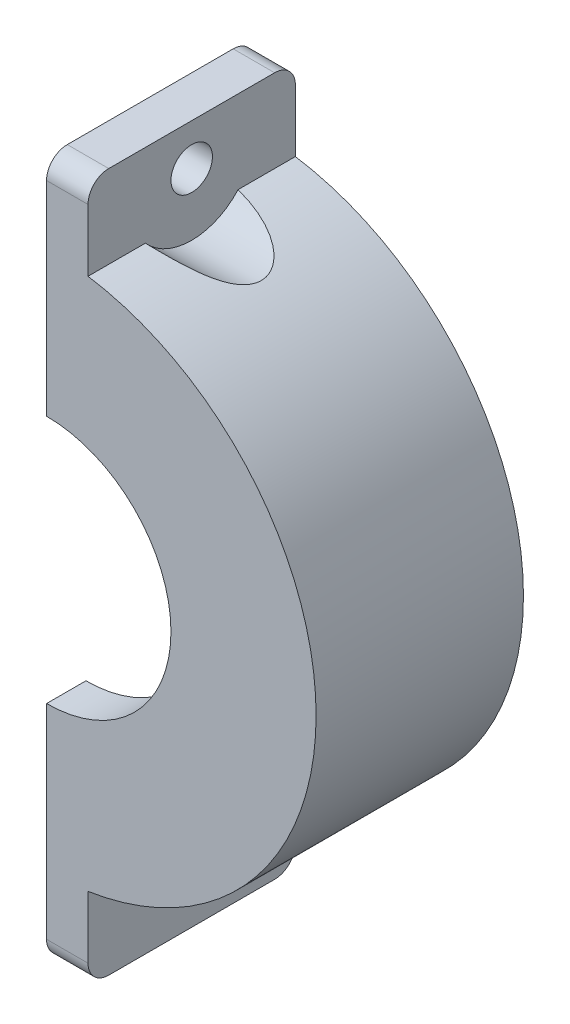
ISO-10303-21;
HEADER;
FILE_DESCRIPTION(('STEP AP214'),'2;1');
FILE_NAME('part.step','',(''),(''),'','','');
FILE_SCHEMA(('AUTOMOTIVE_DESIGN { 1 0 10303 214 1 1 1 1 }'));
ENDSEC;
DATA;
#1=APPLICATION_CONTEXT('core data for automotive mechanical design processes');
#2=APPLICATION_PROTOCOL_DEFINITION('international standard','automotive_design',2000,#1);
#3=PRODUCT_CONTEXT('',#1,'mechanical');
#4=PRODUCT('Part','Part','',(#3));
#5=PRODUCT_RELATED_PRODUCT_CATEGORY('part','',(#4));
#6=PRODUCT_DEFINITION_FORMATION('','',#4);
#7=PRODUCT_DEFINITION_CONTEXT('part definition',#1,'design');
#8=PRODUCT_DEFINITION('design','',#6,#7);
#9=PRODUCT_DEFINITION_SHAPE('','',#8);
#10=(LENGTH_UNIT() NAMED_UNIT(*) SI_UNIT(.MILLI.,.METRE.));
#11=(NAMED_UNIT(*) PLANE_ANGLE_UNIT() SI_UNIT($,.RADIAN.));
#12=(NAMED_UNIT(*) SI_UNIT($,.STERADIAN.) SOLID_ANGLE_UNIT());
#13=UNCERTAINTY_MEASURE_WITH_UNIT(LENGTH_MEASURE(1.E-05),#10,'distance_accuracy_value','');
#14=(GEOMETRIC_REPRESENTATION_CONTEXT(3) GLOBAL_UNCERTAINTY_ASSIGNED_CONTEXT((#13)) GLOBAL_UNIT_ASSIGNED_CONTEXT((#10,
#11,#12)) REPRESENTATION_CONTEXT('',''));
#15=CARTESIAN_POINT('',(0.,0.,0.));
#16=DIRECTION('',(0.,0.,1.));
#17=DIRECTION('',(1.,0.,0.));
#18=AXIS2_PLACEMENT_3D('',#15,#16,#17);
#19=CARTESIAN_POINT('',(0.,0.,0.));
#20=DIRECTION('',(1.,0.,0.));
#21=DIRECTION('',(0.,0.,-1.));
#22=AXIS2_PLACEMENT_3D('',#19,#20,#21);
#23=PLANE('',#22);
#24=CARTESIAN_POINT('',(0.,-14.845233,5.));
#25=DIRECTION('',(1.,0.,0.));
#26=DIRECTION('',(0.,0.,-1.));
#27=AXIS2_PLACEMENT_3D('',#24,#25,#26);
#28=CIRCLE('',#27,1.);
#29=CARTESIAN_POINT('',(0.,-14.845233,4.));
#30=VERTEX_POINT('',#29);
#31=EDGE_CURVE('E270',#30,#30,#28,.T.);
#32=ORIENTED_EDGE('',*,*,#31,.T.);
#33=EDGE_LOOP('',(#32));
#34=FACE_BOUND('',#33,.T.);
#35=DIRECTION('',(0.,0.,1.));
#36=VECTOR('',#35,1.);
#37=CARTESIAN_POINT('',(0.,-16.845233,0.));
#38=LINE('',#37,#36);
#39=CARTESIAN_POINT('',(0.,-16.845233,1.));
#40=VERTEX_POINT('',#39);
#41=CARTESIAN_POINT('',(0.,-16.845233,9.));
#42=VERTEX_POINT('',#41);
#43=EDGE_CURVE('E260',#40,#42,#38,.T.);
#44=ORIENTED_EDGE('',*,*,#43,.T.);
#45=CARTESIAN_POINT('',(0.,-15.845233,9.));
#46=DIRECTION('',(1.,0.,0.));
#47=DIRECTION('',(0.,0.,-1.));
#48=AXIS2_PLACEMENT_3D('',#45,#46,#47);
#49=CIRCLE('',#48,1.);
#50=CARTESIAN_POINT('',(0.,-15.845233,10.));
#51=VERTEX_POINT('',#50);
#52=EDGE_CURVE('E11',#42,#51,#49,.F.);
#53=ORIENTED_EDGE('',*,*,#52,.T.);
#54=DIRECTION('',(0.,1.,0.));
#55=VECTOR('',#54,1.);
#56=CARTESIAN_POINT('',(0.,0.,10.));
#57=LINE('',#56,#55);
#58=CARTESIAN_POINT('',(0.,-6.,10.));
#59=VERTEX_POINT('',#58);
#60=EDGE_CURVE('E197',#51,#59,#57,.T.);
#61=ORIENTED_EDGE('',*,*,#60,.T.);
#62=DIRECTION('',(0.,0.,-1.));
#63=VECTOR('',#62,1.);
#64=CARTESIAN_POINT('',(0.,-6.,18.1));
#65=LINE('',#64,#63);
#66=CARTESIAN_POINT('',(0.,-6.,8.1));
#67=VERTEX_POINT('',#66);
#68=EDGE_CURVE('E276',#59,#67,#65,.T.);
#69=ORIENTED_EDGE('',*,*,#68,.T.);
#70=DIRECTION('',(0.,1.,0.));
#71=VECTOR('',#70,1.);
#72=CARTESIAN_POINT('',(0.,0.,8.1));
#73=LINE('',#72,#71);
#74=CARTESIAN_POINT('',(0.,-11.,8.1));
#75=VERTEX_POINT('',#74);
#76=EDGE_CURVE('E208',#75,#67,#73,.T.);
#77=ORIENTED_EDGE('',*,*,#76,.F.);
#78=DIRECTION('',(0.,0.,-1.));
#79=VECTOR('',#78,1.);
#80=CARTESIAN_POINT('',(0.,-11.,8.1));
#81=LINE('',#80,#79);
#82=CARTESIAN_POINT('',(0.,-11.,0.));
#83=VERTEX_POINT('',#82);
#84=EDGE_CURVE('E214',#75,#83,#81,.T.);
#85=ORIENTED_EDGE('',*,*,#84,.T.);
#86=DIRECTION('',(0.,1.,0.));
#87=VECTOR('',#86,1.);
#88=CARTESIAN_POINT('',(0.,0.,0.));
#89=LINE('',#88,#87);
#90=CARTESIAN_POINT('',(0.,-15.845233,0.));
#91=VERTEX_POINT('',#90);
#92=EDGE_CURVE('E205',#91,#83,#89,.T.);
#93=ORIENTED_EDGE('',*,*,#92,.F.);
#94=CARTESIAN_POINT('',(0.,-15.845233,1.));
#95=DIRECTION('',(1.,0.,0.));
#96=DIRECTION('',(0.,0.,-1.));
#97=AXIS2_PLACEMENT_3D('',#94,#95,#96);
#98=CIRCLE('',#97,1.);
#99=EDGE_CURVE('E220',#91,#40,#98,.F.);
#100=ORIENTED_EDGE('',*,*,#99,.T.);
#101=EDGE_LOOP('',(#44,#53,#61,#69,#77,#85,#93,#100));
#102=FACE_BOUND('',#101,.T.);
#103=ADVANCED_FACE('F41',(#34,#102),#23,.F.);
#104=CARTESIAN_POINT('',(0.,0.,10.));
#105=DIRECTION('',(0.,0.,-1.));
#106=DIRECTION('',(-1.,0.,0.));
#107=AXIS2_PLACEMENT_3D('',#104,#105,#106);
#108=CYLINDRICAL_SURFACE('',#107,13.);
#109=DIRECTION('',(0.,0.,-1.));
#110=VECTOR('',#109,1.);
#111=CARTESIAN_POINT('',(2.,-12.8452325786651,10.));
#112=LINE('',#111,#110);
#113=CARTESIAN_POINT('',(2.,-12.8452325786651,7.23606760064635));
#114=VERTEX_POINT('',#113);
#115=CARTESIAN_POINT('',(2.,-12.8452325786651,10.));
#116=VERTEX_POINT('',#115);
#117=EDGE_CURVE('E166',#114,#116,#112,.F.);
#118=ORIENTED_EDGE('',*,*,#117,.F.);
#119=CARTESIAN_POINT('',(2.,-12.8452325786651,7.23606760064635));
#120=CARTESIAN_POINT('',(2.08276539776827,-12.832346383096,7.22453780908436));
#121=CARTESIAN_POINT('',(2.16528098528265,-12.8186787917862,7.21211732607741));
#122=CARTESIAN_POINT('',(2.32974059715563,-12.7898116161668,7.18532230038956));
#123=CARTESIAN_POINT('',(2.41168451084763,-12.7746117435749,7.17094738982602));
#124=CARTESIAN_POINT('',(2.65711028370859,-12.7266491932216,7.12452421743763));
#125=CARTESIAN_POINT('',(2.8195699401386,-12.6916197771942,7.08926058654797));
#126=CARTESIAN_POINT('',(3.14215760745936,-12.6156480987045,7.00800369253263));
#127=CARTESIAN_POINT('',(3.30224769106317,-12.5746517541744,6.96190962505904));
#128=CARTESIAN_POINT('',(3.61658186305981,-12.4878660355328,6.85674135085243));
#129=CARTESIAN_POINT('',(3.77083613340113,-12.4420855886643,6.79769110189736));
#130=CARTESIAN_POINT('',(3.97780972230637,-12.3766158727657,6.70496027102279));
#131=CARTESIAN_POINT('',(4.03414540459908,-12.3583617373446,6.67827071728123));
#132=CARTESIAN_POINT('',(4.14539272047412,-12.3214915049511,6.62229889927634));
#133=CARTESIAN_POINT('',(4.20030430207607,-12.3028753948097,6.59301654054607));
#134=CARTESIAN_POINT('',(4.3625132342028,-12.2466944619012,6.5009288139637));
#135=CARTESIAN_POINT('',(4.4673466430409,-12.208777343158,6.43385582725093));
#136=CARTESIAN_POINT('',(4.6686308718264,-12.1332422156882,6.28535766469762));
#137=CARTESIAN_POINT('',(4.764971682875,-12.0956326336012,6.20377661192219));
#138=CARTESIAN_POINT('',(4.94300569032877,-12.0239688496214,6.02455659258834));
#139=CARTESIAN_POINT('',(5.02474358317832,-11.9899039367217,5.92696844267873));
#140=CARTESIAN_POINT('',(5.13892380583905,-11.9412617927331,5.75597563300521));
#141=CARTESIAN_POINT('',(5.17819705472851,-11.9242469912654,5.68784475398095));
#142=CARTESIAN_POINT('',(5.24641863713935,-11.8943883114915,5.54568849700293));
#143=CARTESIAN_POINT('',(5.27537408037415,-11.8815415616452,5.47166722115098));
#144=CARTESIAN_POINT('',(5.32102514929996,-11.8611693984822,5.31840252847306));
#145=CARTESIAN_POINT('',(5.3376067430378,-11.8536935034973,5.23911769871211));
#146=CARTESIAN_POINT('',(5.35646045740204,-11.8451867800537,5.07853089842933));
#147=CARTESIAN_POINT('',(5.35874393372024,-11.8441508369327,4.99723058016503));
#148=CARTESIAN_POINT('',(5.34939656220391,-11.8483739608607,4.84532774436822));
#149=CARTESIAN_POINT('',(5.33938023482922,-11.8529026393309,4.77459772969805));
#150=CARTESIAN_POINT('',(5.30888625918949,-11.8665918891346,4.63591122426401));
#151=CARTESIAN_POINT('',(5.288403644229,-11.8757546595193,4.56795606683569));
#152=CARTESIAN_POINT('',(5.23136426522048,-11.9010099321451,4.41790416213146));
#153=CARTESIAN_POINT('',(5.19192450300897,-11.9183197311891,4.337114649377));
#154=CARTESIAN_POINT('',(5.10136001388693,-11.9573644241691,4.18359085337653));
#155=CARTESIAN_POINT('',(5.05021471874528,-11.9791070998478,4.11087108778678));
#156=CARTESIAN_POINT('',(4.91167957000135,-12.0367520441712,3.93973642309407));
#157=CARTESIAN_POINT('',(4.81885308344476,-12.0743498810984,3.84633192644882));
#158=CARTESIAN_POINT('',(4.62027394399353,-12.1517286562157,3.67567094434097));
#159=CARTESIAN_POINT('',(4.51449183887476,-12.1915144509099,3.59845237610348));
#160=CARTESIAN_POINT('',(4.30689725962327,-12.2662709427615,3.46570941127435));
#161=CARTESIAN_POINT('',(4.20601760849179,-12.3012712574403,3.40871328465918));
#162=CARTESIAN_POINT('',(3.99922788188801,-12.3700470385925,3.30371065734754));
#163=CARTESIAN_POINT('',(3.89331371615758,-12.4038214684184,3.25571162835656));
#164=CARTESIAN_POINT('',(3.67745382580164,-12.4695273011324,3.16722510875975));
#165=CARTESIAN_POINT('',(3.56749636174045,-12.5014525077052,3.12676196724583));
#166=CARTESIAN_POINT('',(3.34478467306144,-12.562872156966,3.05239828887136));
#167=CARTESIAN_POINT('',(3.23203139038285,-12.5923674042359,3.01849557473736));
#168=CARTESIAN_POINT('',(3.02675195791729,-12.6430870336786,2.96243212255445));
#169=CARTESIAN_POINT('',(2.93461383158742,-12.6647965205399,2.93927374085533));
#170=CARTESIAN_POINT('',(2.749166290102,-12.7063414816939,2.89618478999816));
#171=CARTESIAN_POINT('',(2.65585683789329,-12.726176896533,2.87625432322912));
#172=CARTESIAN_POINT('',(2.46921353075594,-12.7636966745003,2.83946939464871));
#173=CARTESIAN_POINT('',(2.37588919666887,-12.7814005142867,2.82258624261788));
#174=CARTESIAN_POINT('',(2.18848061890501,-12.8148204603245,2.79139532580996));
#175=CARTESIAN_POINT('',(2.09439656754685,-12.8305370538318,2.77708692935912));
#176=CARTESIAN_POINT('',(2.,-12.8452325786651,2.76393239935364));
#177=B_SPLINE_CURVE_WITH_KNOTS('',3,(#119,#120,#121,#122,#123,#124,#125,#126,#127,#128,#129,
#130,#131,#132,#133,#134,#135,#136,#137,#138,#139,#140,#141,#142,#143,#144,#145,#146,#147,#148,
#149,#150,#151,#152,#153,#154,#155,#156,#157,#158,#159,#160,#161,#162,#163,#164,#165,#166,#167,
#168,#169,#170,#171,#172,#173,#174,#175,#176),.UNSPECIFIED.,.F.,.F.,(4,2,2,2,2,2,2,2,2,2,2,2,2,
2,2,2,2,2,2,2,2,2,2,2,2,2,2,2,4),(0.,0.253638270320282,0.507324349334978,1.01658094320564,
1.53077960076528,2.04403532894383,2.23884410768089,2.43365998705591,2.82308167551149,
3.21697250796355,3.60963625995656,3.85020837130518,4.09061438905581,4.33320941411776,
4.57561174359325,4.78933039348787,5.00315055622355,5.27629269482021,5.54991851749505,
5.95846349908766,6.36795510015366,6.73054948404562,7.09344366577697,7.4574907838873,
7.82141687410746,8.11369577669264,8.40598394850822,8.69535761917483,8.98466019971424),.UNSPECIFIED.);
#178=CARTESIAN_POINT('',(2.,-12.8452325786651,2.76393239935365));
#179=VERTEX_POINT('',#178);
#180=EDGE_CURVE('E155',#114,#179,#177,.T.);
#181=ORIENTED_EDGE('',*,*,#180,.T.);
#182=CARTESIAN_POINT('',(2.,-12.8452325786651,0.));
#183=VERTEX_POINT('',#182);
#184=EDGE_CURVE('E163',#183,#179,#112,.F.);
#185=ORIENTED_EDGE('',*,*,#184,.F.);
#186=CARTESIAN_POINT('',(0.,0.,0.));
#187=DIRECTION('',(0.,0.,1.));
#188=DIRECTION('',(1.,0.,0.));
#189=AXIS2_PLACEMENT_3D('',#186,#187,#188);
#190=CIRCLE('',#189,13.);
#191=CARTESIAN_POINT('',(2.,12.8452325786651,0.));
#192=VERTEX_POINT('',#191);
#193=EDGE_CURVE('E199',#183,#192,#190,.T.);
#194=ORIENTED_EDGE('',*,*,#193,.T.);
#195=DIRECTION('',(0.,0.,-1.));
#196=VECTOR('',#195,1.);
#197=CARTESIAN_POINT('',(2.,12.8452325786651,10.));
#198=LINE('',#197,#196);
#199=CARTESIAN_POINT('',(2.,12.8452325786651,2.76393239935365));
#200=VERTEX_POINT('',#199);
#201=EDGE_CURVE('E187',#200,#192,#198,.T.);
#202=ORIENTED_EDGE('',*,*,#201,.F.);
#203=CARTESIAN_POINT('',(2.,12.8452325786651,2.76393239935365));
#204=CARTESIAN_POINT('',(2.08276539776826,12.832346383096,2.77546219091565));
#205=CARTESIAN_POINT('',(2.16528098528265,12.8186787917862,2.78788267392259));
#206=CARTESIAN_POINT('',(2.32974059715562,12.7898116161668,2.81467769961044));
#207=CARTESIAN_POINT('',(2.41168451084762,12.7746117435749,2.82905261017398));
#208=CARTESIAN_POINT('',(2.65711028370858,12.7266491932216,2.87547578256238));
#209=CARTESIAN_POINT('',(2.8195699401386,12.6916197771942,2.91073941345203));
#210=CARTESIAN_POINT('',(3.14215760745935,12.6156480987045,2.99199630746737));
#211=CARTESIAN_POINT('',(3.30224769106316,12.5746517541744,3.03809037494096));
#212=CARTESIAN_POINT('',(3.61658186305981,12.4878660355328,3.14325864914758));
#213=CARTESIAN_POINT('',(3.77083613340113,12.4420855886643,3.20230889810264));
#214=CARTESIAN_POINT('',(3.97780972230637,12.3766158727657,3.29503972897721));
#215=CARTESIAN_POINT('',(4.03414540459908,12.3583617373446,3.32172928271878));
#216=CARTESIAN_POINT('',(4.14539272047412,12.3214915049511,3.37770110072366));
#217=CARTESIAN_POINT('',(4.20030430207607,12.3028753948097,3.40698345945394));
#218=CARTESIAN_POINT('',(4.3625132342028,12.2466944619012,3.4990711860363));
#219=CARTESIAN_POINT('',(4.4673466430409,12.208777343158,3.56614417274907));
#220=CARTESIAN_POINT('',(4.6686308718264,12.1332422156882,3.71464233530238));
#221=CARTESIAN_POINT('',(4.764971682875,12.0956326336012,3.79622338807781));
#222=CARTESIAN_POINT('',(4.94300569032877,12.0239688496214,3.97544340741166));
#223=CARTESIAN_POINT('',(5.02474358317832,11.9899039367217,4.07303155732127));
#224=CARTESIAN_POINT('',(5.13892380583905,11.9412617927331,4.24402436699479));
#225=CARTESIAN_POINT('',(5.17819705472851,11.9242469912654,4.31215524601905));
#226=CARTESIAN_POINT('',(5.24641863713935,11.8943883114915,4.45431150299707));
#227=CARTESIAN_POINT('',(5.27537408037415,11.8815415616452,4.52833277884902));
#228=CARTESIAN_POINT('',(5.32102514929996,11.8611693984822,4.68159747152695));
#229=CARTESIAN_POINT('',(5.3376067430378,11.8536935034973,4.76088230128789));
#230=CARTESIAN_POINT('',(5.35646045740204,11.8451867800537,4.92146910157067));
#231=CARTESIAN_POINT('',(5.35874393372023,11.8441508369327,5.00276941983497));
#232=CARTESIAN_POINT('',(5.3493965622039,11.8483739608607,5.15467225563178));
#233=CARTESIAN_POINT('',(5.33938023482922,11.8529026393309,5.22540227030195));
#234=CARTESIAN_POINT('',(5.30888625918949,11.8665918891346,5.36408877573599));
#235=CARTESIAN_POINT('',(5.28840364422899,11.8757546595193,5.43204393316431));
#236=CARTESIAN_POINT('',(5.23136426522048,11.9010099321451,5.58209583786854));
#237=CARTESIAN_POINT('',(5.19192450300896,11.9183197311891,5.66288535062301));
#238=CARTESIAN_POINT('',(5.10136001388693,11.9573644241691,5.81640914662347));
#239=CARTESIAN_POINT('',(5.05021471874528,11.9791070998478,5.88912891221322));
#240=CARTESIAN_POINT('',(4.91167957000135,12.0367520441712,6.06026357690593));
#241=CARTESIAN_POINT('',(4.81885308344476,12.0743498810984,6.15366807355119));
#242=CARTESIAN_POINT('',(4.62027394399354,12.1517286562157,6.32432905565904));
#243=CARTESIAN_POINT('',(4.51449183887476,12.1915144509099,6.40154762389653));
#244=CARTESIAN_POINT('',(4.30689725962327,12.2662709427615,6.53429058872565));
#245=CARTESIAN_POINT('',(4.20601760849179,12.3012712574403,6.59128671534082));
#246=CARTESIAN_POINT('',(3.99922788188801,12.3700470385925,6.69628934265246));
#247=CARTESIAN_POINT('',(3.89331371615759,12.4038214684184,6.74428837164344));
#248=CARTESIAN_POINT('',(3.67745382580164,12.4695273011324,6.83277489124025));
#249=CARTESIAN_POINT('',(3.56749636174046,12.5014525077052,6.87323803275417));
#250=CARTESIAN_POINT('',(3.34478467306145,12.562872156966,6.94760171112864));
#251=CARTESIAN_POINT('',(3.23203139038285,12.5923674042359,6.98150442526265));
#252=CARTESIAN_POINT('',(3.0267519579173,12.6430870336786,7.03756787744555));
#253=CARTESIAN_POINT('',(2.93461383158742,12.6647965205399,7.06072625914467));
#254=CARTESIAN_POINT('',(2.749166290102,12.7063414816939,7.10381521000184));
#255=CARTESIAN_POINT('',(2.65585683789329,12.726176896533,7.12374567677088));
#256=CARTESIAN_POINT('',(2.46921353075594,12.7636966745003,7.16053060535129));
#257=CARTESIAN_POINT('',(2.37588919666887,12.7814005142867,7.17741375738212));
#258=CARTESIAN_POINT('',(2.18848061890501,12.8148204603245,7.20860467419005));
#259=CARTESIAN_POINT('',(2.09439656754685,12.8305370538318,7.22291307064089));
#260=CARTESIAN_POINT('',(2.,12.8452325786651,7.23606760064636));
#261=B_SPLINE_CURVE_WITH_KNOTS('',3,(#203,#204,#205,#206,#207,#208,#209,#210,#211,#212,#213,
#214,#215,#216,#217,#218,#219,#220,#221,#222,#223,#224,#225,#226,#227,#228,#229,#230,#231,#232,
#233,#234,#235,#236,#237,#238,#239,#240,#241,#242,#243,#244,#245,#246,#247,#248,#249,#250,#251,
#252,#253,#254,#255,#256,#257,#258,#259,#260),.UNSPECIFIED.,.F.,.F.,(4,2,2,2,2,2,2,2,2,2,2,2,2,
2,2,2,2,2,2,2,2,2,2,2,2,2,2,2,4),(0.,0.253638270320283,0.507324349334978,1.01658094320564,
1.53077960076528,2.04403532894383,2.23884410768089,2.43365998705591,2.82308167551149,
3.21697250796356,3.60963625995656,3.85020837130519,4.09061438905581,4.33320941411776,
4.57561174359326,4.78933039348788,5.00315055622356,5.27629269482022,5.54991851749506,
5.95846349908767,6.36795510015366,6.73054948404563,7.09344366577697,7.4574907838873,
7.82141687410746,8.11369577669264,8.40598394850822,8.69535761917484,8.98466019971425),.UNSPECIFIED.);
#262=CARTESIAN_POINT('',(2.,12.8452325786651,7.23606760064635));
#263=VERTEX_POINT('',#262);
#264=EDGE_CURVE('E286',#200,#263,#261,.T.);
#265=ORIENTED_EDGE('',*,*,#264,.T.);
#266=CARTESIAN_POINT('',(2.,12.8452325786651,10.));
#267=VERTEX_POINT('',#266);
#268=EDGE_CURVE('E188',#267,#263,#198,.T.);
#269=ORIENTED_EDGE('',*,*,#268,.F.);
#270=CARTESIAN_POINT('',(0.,0.,10.));
#271=DIRECTION('',(0.,0.,1.));
#272=DIRECTION('',(1.,0.,0.));
#273=AXIS2_PLACEMENT_3D('',#270,#271,#272);
#274=CIRCLE('',#273,13.);
#275=EDGE_CURVE('E200',#116,#267,#274,.T.);
#276=ORIENTED_EDGE('',*,*,#275,.F.);
#277=EDGE_LOOP('',(#118,#181,#185,#194,#202,#265,#269,#276));
#278=FACE_BOUND('',#277,.T.);
#279=ADVANCED_FACE('F161',(#278),#108,.T.);
#280=CARTESIAN_POINT('',(0.,0.,10.));
#281=DIRECTION('',(0.,0.,1.));
#282=DIRECTION('',(1.,0.,0.));
#283=AXIS2_PLACEMENT_3D('',#280,#281,#282);
#284=PLANE('',#283);
#285=ORIENTED_EDGE('',*,*,#60,.F.);
#286=DIRECTION('',(1.,0.,0.));
#287=VECTOR('',#286,1.);
#288=CARTESIAN_POINT('',(2.,-15.845233,10.));
#289=LINE('',#288,#287);
#290=CARTESIAN_POINT('',(2.,-15.845233,10.));
#291=VERTEX_POINT('',#290);
#292=EDGE_CURVE('E246',#51,#291,#289,.T.);
#293=ORIENTED_EDGE('',*,*,#292,.T.);
#294=DIRECTION('',(0.,-1.,0.));
#295=VECTOR('',#294,1.);
#296=CARTESIAN_POINT('',(2.,-11.845233,10.));
#297=LINE('',#296,#295);
#298=EDGE_CURVE('E178',#116,#291,#297,.T.);
#299=ORIENTED_EDGE('',*,*,#298,.F.);
#300=ORIENTED_EDGE('',*,*,#275,.T.);
#301=DIRECTION('',(0.,-1.,0.));
#302=VECTOR('',#301,1.);
#303=CARTESIAN_POINT('',(2.,16.845233,10.));
#304=LINE('',#303,#302);
#305=CARTESIAN_POINT('',(2.,15.845233,10.));
#306=VERTEX_POINT('',#305);
#307=EDGE_CURVE('E185',#306,#267,#304,.T.);
#308=ORIENTED_EDGE('',*,*,#307,.F.);
#309=DIRECTION('',(1.,0.,0.));
#310=VECTOR('',#309,1.);
#311=CARTESIAN_POINT('',(0.,15.845233,10.));
#312=LINE('',#311,#310);
#313=CARTESIAN_POINT('',(0.,15.845233,10.));
#314=VERTEX_POINT('',#313);
#315=EDGE_CURVE('E242',#306,#314,#312,.F.);
#316=ORIENTED_EDGE('',*,*,#315,.T.);
#317=CARTESIAN_POINT('',(0.,6.,10.));
#318=VERTEX_POINT('',#317);
#319=EDGE_CURVE('E194',#318,#314,#57,.T.);
#320=ORIENTED_EDGE('',*,*,#319,.F.);
#321=CARTESIAN_POINT('',(0.,0.,10.));
#322=DIRECTION('',(0.,0.,1.));
#323=DIRECTION('',(1.,0.,0.));
#324=AXIS2_PLACEMENT_3D('',#321,#322,#323);
#325=CIRCLE('',#324,6.);
#326=EDGE_CURVE('E279',#59,#318,#325,.T.);
#327=ORIENTED_EDGE('',*,*,#326,.F.);
#328=EDGE_LOOP('',(#285,#293,#299,#300,#308,#316,#320,#327));
#329=FACE_BOUND('',#328,.T.);
#330=ADVANCED_FACE('F253',(#329),#284,.T.);
#331=CARTESIAN_POINT('',(0.,0.,0.));
#332=DIRECTION('',(0.,0.,1.));
#333=DIRECTION('',(1.,0.,0.));
#334=AXIS2_PLACEMENT_3D('',#331,#332,#333);
#335=PLANE('',#334);
#336=CARTESIAN_POINT('',(0.,11.,0.));
#337=VERTEX_POINT('',#336);
#338=CARTESIAN_POINT('',(0.,15.845233,0.));
#339=VERTEX_POINT('',#338);
#340=EDGE_CURVE('E203',#337,#339,#89,.T.);
#341=ORIENTED_EDGE('',*,*,#340,.T.);
#342=DIRECTION('',(-1.,0.,0.));
#343=VECTOR('',#342,1.);
#344=CARTESIAN_POINT('',(2.,15.845233,0.));
#345=LINE('',#344,#343);
#346=CARTESIAN_POINT('',(2.,15.845233,0.));
#347=VERTEX_POINT('',#346);
#348=EDGE_CURVE('E232',#339,#347,#345,.F.);
#349=ORIENTED_EDGE('',*,*,#348,.T.);
#350=DIRECTION('',(0.,-1.,0.));
#351=VECTOR('',#350,1.);
#352=CARTESIAN_POINT('',(2.,16.845233,0.));
#353=LINE('',#352,#351);
#354=EDGE_CURVE('E183',#347,#192,#353,.T.);
#355=ORIENTED_EDGE('',*,*,#354,.T.);
#356=ORIENTED_EDGE('',*,*,#193,.F.);
#357=DIRECTION('',(0.,-1.,0.));
#358=VECTOR('',#357,1.);
#359=CARTESIAN_POINT('',(2.,-11.845233,0.));
#360=LINE('',#359,#358);
#361=CARTESIAN_POINT('',(2.,-15.845233,0.));
#362=VERTEX_POINT('',#361);
#363=EDGE_CURVE('E172',#183,#362,#360,.T.);
#364=ORIENTED_EDGE('',*,*,#363,.T.);
#365=DIRECTION('',(-1.,0.,0.));
#366=VECTOR('',#365,1.);
#367=CARTESIAN_POINT('',(0.,-15.845233,0.));
#368=LINE('',#367,#366);
#369=EDGE_CURVE('E217',#362,#91,#368,.T.);
#370=ORIENTED_EDGE('',*,*,#369,.T.);
#371=ORIENTED_EDGE('',*,*,#92,.T.);
#372=CARTESIAN_POINT('',(0.,0.,0.));
#373=DIRECTION('',(0.,0.,-1.));
#374=DIRECTION('',(-1.,0.,0.));
#375=AXIS2_PLACEMENT_3D('',#372,#373,#374);
#376=CIRCLE('',#375,11.);
#377=EDGE_CURVE('E191',#337,#83,#376,.T.);
#378=ORIENTED_EDGE('',*,*,#377,.F.);
#379=EDGE_LOOP('',(#341,#349,#355,#356,#364,#370,#371,#378));
#380=FACE_BOUND('',#379,.T.);
#381=ADVANCED_FACE('F341',(#380),#335,.F.);
#382=CARTESIAN_POINT('',(0.,14.845233,5.));
#383=DIRECTION('',(1.,0.,0.));
#384=DIRECTION('',(0.,0.,-1.));
#385=AXIS2_PLACEMENT_3D('',#382,#383,#384);
#386=CIRCLE('',#385,1.);
#387=CARTESIAN_POINT('',(0.,14.845233,4.));
#388=VERTEX_POINT('',#387);
#389=EDGE_CURVE('E264',#388,#388,#386,.T.);
#390=ORIENTED_EDGE('',*,*,#389,.T.);
#391=EDGE_LOOP('',(#390));
#392=FACE_BOUND('',#391,.T.);
#393=ORIENTED_EDGE('',*,*,#319,.T.);
#394=CARTESIAN_POINT('',(0.,15.845233,9.));
#395=DIRECTION('',(1.,0.,0.));
#396=DIRECTION('',(0.,0.,-1.));
#397=AXIS2_PLACEMENT_3D('',#394,#395,#396);
#398=CIRCLE('',#397,1.);
#399=CARTESIAN_POINT('',(0.,16.845233,9.));
#400=VERTEX_POINT('',#399);
#401=EDGE_CURVE('E244',#314,#400,#398,.F.);
#402=ORIENTED_EDGE('',*,*,#401,.T.);
#403=DIRECTION('',(0.,0.,1.));
#404=VECTOR('',#403,1.);
#405=CARTESIAN_POINT('',(0.,16.845233,0.));
#406=LINE('',#405,#404);
#407=CARTESIAN_POINT('',(0.,16.845233,1.));
#408=VERTEX_POINT('',#407);
#409=EDGE_CURVE('E173',#408,#400,#406,.T.);
#410=ORIENTED_EDGE('',*,*,#409,.F.);
#411=CARTESIAN_POINT('',(0.,15.845233,1.));
#412=DIRECTION('',(1.,0.,0.));
#413=DIRECTION('',(0.,0.,-1.));
#414=AXIS2_PLACEMENT_3D('',#411,#412,#413);
#415=CIRCLE('',#414,1.);
#416=EDGE_CURVE('E230',#408,#339,#415,.F.);
#417=ORIENTED_EDGE('',*,*,#416,.T.);
#418=ORIENTED_EDGE('',*,*,#340,.F.);
#419=DIRECTION('',(0.,0.,-1.));
#420=VECTOR('',#419,1.);
#421=CARTESIAN_POINT('',(0.,11.,8.1));
#422=LINE('',#421,#420);
#423=CARTESIAN_POINT('',(0.,11.,8.1));
#424=VERTEX_POINT('',#423);
#425=EDGE_CURVE('E211',#337,#424,#422,.F.);
#426=ORIENTED_EDGE('',*,*,#425,.T.);
#427=CARTESIAN_POINT('',(0.,6.,8.1));
#428=VERTEX_POINT('',#427);
#429=EDGE_CURVE('E207',#428,#424,#73,.T.);
#430=ORIENTED_EDGE('',*,*,#429,.F.);
#431=DIRECTION('',(0.,0.,-1.));
#432=VECTOR('',#431,1.);
#433=CARTESIAN_POINT('',(0.,6.,18.1));
#434=LINE('',#433,#432);
#435=EDGE_CURVE('E281',#428,#318,#434,.F.);
#436=ORIENTED_EDGE('',*,*,#435,.T.);
#437=EDGE_LOOP('',(#393,#402,#410,#417,#418,#426,#430,#436));
#438=FACE_BOUND('',#437,.T.);
#439=ADVANCED_FACE('F337',(#392,#438),#23,.F.);
#440=CARTESIAN_POINT('',(0.,0.,8.1));
#441=DIRECTION('',(0.,0.,-1.));
#442=DIRECTION('',(-1.,0.,0.));
#443=AXIS2_PLACEMENT_3D('',#440,#441,#442);
#444=CYLINDRICAL_SURFACE('',#443,11.);
#445=CARTESIAN_POINT('',(0.,0.,8.1));
#446=DIRECTION('',(0.,0.,-1.));
#447=DIRECTION('',(-1.,0.,0.));
#448=AXIS2_PLACEMENT_3D('',#445,#446,#447);
#449=CIRCLE('',#448,11.);
#450=EDGE_CURVE('E192',#424,#75,#449,.T.);
#451=ORIENTED_EDGE('',*,*,#450,.F.);
#452=ORIENTED_EDGE('',*,*,#425,.F.);
#453=ORIENTED_EDGE('',*,*,#377,.T.);
#454=ORIENTED_EDGE('',*,*,#84,.F.);
#455=EDGE_LOOP('',(#451,#452,#453,#454));
#456=FACE_BOUND('',#455,.T.);
#457=ADVANCED_FACE('F333',(#456),#444,.F.);
#458=CARTESIAN_POINT('',(0.,0.,8.1));
#459=DIRECTION('',(0.,0.,-1.));
#460=DIRECTION('',(-1.,0.,0.));
#461=AXIS2_PLACEMENT_3D('',#458,#459,#460);
#462=PLANE('',#461);
#463=CARTESIAN_POINT('',(0.,0.,8.1));
#464=DIRECTION('',(0.,0.,-1.));
#465=DIRECTION('',(-1.,0.,0.));
#466=AXIS2_PLACEMENT_3D('',#463,#464,#465);
#467=CIRCLE('',#466,6.);
#468=EDGE_CURVE('E284',#428,#67,#467,.T.);
#469=ORIENTED_EDGE('',*,*,#468,.F.);
#470=ORIENTED_EDGE('',*,*,#429,.T.);
#471=ORIENTED_EDGE('',*,*,#450,.T.);
#472=ORIENTED_EDGE('',*,*,#76,.T.);
#473=EDGE_LOOP('',(#469,#470,#471,#472));
#474=FACE_BOUND('',#473,.T.);
#475=ADVANCED_FACE('F329',(#474),#462,.T.);
#476=CARTESIAN_POINT('',(2.,16.845233,0.));
#477=DIRECTION('',(-1.,0.,0.));
#478=DIRECTION('',(0.,0.,1.));
#479=AXIS2_PLACEMENT_3D('',#476,#477,#478);
#480=PLANE('',#479);
#481=DIRECTION('',(0.,0.,-1.));
#482=VECTOR('',#481,1.);
#483=CARTESIAN_POINT('',(2.,16.845233,0.));
#484=LINE('',#483,#482);
#485=CARTESIAN_POINT('',(2.,16.845233,9.));
#486=VERTEX_POINT('',#485);
#487=CARTESIAN_POINT('',(2.,16.845233,1.));
#488=VERTEX_POINT('',#487);
#489=EDGE_CURVE('E176',#486,#488,#484,.T.);
#490=ORIENTED_EDGE('',*,*,#489,.F.);
#491=CARTESIAN_POINT('',(2.,15.845233,9.));
#492=DIRECTION('',(-1.,0.,0.));
#493=DIRECTION('',(0.,0.,1.));
#494=AXIS2_PLACEMENT_3D('',#491,#492,#493);
#495=CIRCLE('',#494,1.);
#496=EDGE_CURVE('E240',#486,#306,#495,.F.);
#497=ORIENTED_EDGE('',*,*,#496,.T.);
#498=ORIENTED_EDGE('',*,*,#307,.T.);
#499=ORIENTED_EDGE('',*,*,#268,.T.);
#500=CARTESIAN_POINT('',(2.,14.845233,5.));
#501=DIRECTION('',(1.,0.,0.));
#502=DIRECTION('',(0.,0.,-1.));
#503=AXIS2_PLACEMENT_3D('',#500,#501,#502);
#504=CIRCLE('',#503,3.);
#505=EDGE_CURVE('E167',#263,#200,#504,.T.);
#506=ORIENTED_EDGE('',*,*,#505,.T.);
#507=ORIENTED_EDGE('',*,*,#201,.T.);
#508=ORIENTED_EDGE('',*,*,#354,.F.);
#509=CARTESIAN_POINT('',(2.,15.845233,1.));
#510=DIRECTION('',(-1.,0.,0.));
#511=DIRECTION('',(0.,0.,1.));
#512=AXIS2_PLACEMENT_3D('',#509,#510,#511);
#513=CIRCLE('',#512,1.);
#514=EDGE_CURVE('E234',#347,#488,#513,.F.);
#515=ORIENTED_EDGE('',*,*,#514,.T.);
#516=EDGE_LOOP('',(#490,#497,#498,#499,#506,#507,#508,#515));
#517=FACE_BOUND('',#516,.T.);
#518=CARTESIAN_POINT('',(2.,14.845233,5.));
#519=DIRECTION('',(1.,0.,0.));
#520=DIRECTION('',(0.,0.,-1.));
#521=AXIS2_PLACEMENT_3D('',#518,#519,#520);
#522=CIRCLE('',#521,1.);
#523=CARTESIAN_POINT('',(2.,14.845233,4.));
#524=VERTEX_POINT('',#523);
#525=EDGE_CURVE('E267',#524,#524,#522,.T.);
#526=ORIENTED_EDGE('',*,*,#525,.F.);
#527=EDGE_LOOP('',(#526));
#528=FACE_BOUND('',#527,.T.);
#529=ADVANCED_FACE('F325',(#517,#528),#480,.F.);
#530=CARTESIAN_POINT('',(0.,16.845233,0.));
#531=DIRECTION('',(0.,1.,0.));
#532=DIRECTION('',(0.,0.,1.));
#533=AXIS2_PLACEMENT_3D('',#530,#531,#532);
#534=PLANE('',#533);
#535=ORIENTED_EDGE('',*,*,#409,.T.);
#536=DIRECTION('',(1.,0.,0.));
#537=VECTOR('',#536,1.);
#538=CARTESIAN_POINT('',(0.,16.845233,9.));
#539=LINE('',#538,#537);
#540=EDGE_CURVE('E237',#400,#486,#539,.T.);
#541=ORIENTED_EDGE('',*,*,#540,.T.);
#542=ORIENTED_EDGE('',*,*,#489,.T.);
#543=DIRECTION('',(-1.,0.,0.));
#544=VECTOR('',#543,1.);
#545=CARTESIAN_POINT('',(0.,16.845233,1.));
#546=LINE('',#545,#544);
#547=EDGE_CURVE('E227',#488,#408,#546,.T.);
#548=ORIENTED_EDGE('',*,*,#547,.T.);
#549=EDGE_LOOP('',(#535,#541,#542,#548));
#550=FACE_BOUND('',#549,.T.);
#551=ADVANCED_FACE('F322',(#550),#534,.T.);
#552=CARTESIAN_POINT('',(2.,-11.845233,0.));
#553=DIRECTION('',(-1.,0.,0.));
#554=DIRECTION('',(0.,0.,1.));
#555=AXIS2_PLACEMENT_3D('',#552,#553,#554);
#556=PLANE('',#555);
#557=ORIENTED_EDGE('',*,*,#298,.T.);
#558=CARTESIAN_POINT('',(2.,-15.845233,9.));
#559=DIRECTION('',(-1.,0.,0.));
#560=DIRECTION('',(0.,0.,1.));
#561=AXIS2_PLACEMENT_3D('',#558,#559,#560);
#562=CIRCLE('',#561,1.);
#563=CARTESIAN_POINT('',(2.,-16.845233,9.));
#564=VERTEX_POINT('',#563);
#565=EDGE_CURVE('E63',#291,#564,#562,.F.);
#566=ORIENTED_EDGE('',*,*,#565,.T.);
#567=DIRECTION('',(0.,0.,-1.));
#568=VECTOR('',#567,1.);
#569=CARTESIAN_POINT('',(2.,-16.845233,0.));
#570=LINE('',#569,#568);
#571=CARTESIAN_POINT('',(2.,-16.845233,1.));
#572=VERTEX_POINT('',#571);
#573=EDGE_CURVE('E257',#564,#572,#570,.T.);
#574=ORIENTED_EDGE('',*,*,#573,.T.);
#575=CARTESIAN_POINT('',(2.,-15.845233,1.));
#576=DIRECTION('',(-1.,0.,0.));
#577=DIRECTION('',(0.,0.,1.));
#578=AXIS2_PLACEMENT_3D('',#575,#576,#577);
#579=CIRCLE('',#578,1.);
#580=EDGE_CURVE('E225',#572,#362,#579,.F.);
#581=ORIENTED_EDGE('',*,*,#580,.T.);
#582=ORIENTED_EDGE('',*,*,#363,.F.);
#583=ORIENTED_EDGE('',*,*,#184,.T.);
#584=CARTESIAN_POINT('',(2.,-14.845233,5.));
#585=DIRECTION('',(1.,0.,0.));
#586=DIRECTION('',(0.,0.,-1.));
#587=AXIS2_PLACEMENT_3D('',#584,#585,#586);
#588=CIRCLE('',#587,3.);
#589=EDGE_CURVE('E152',#179,#114,#588,.T.);
#590=ORIENTED_EDGE('',*,*,#589,.T.);
#591=ORIENTED_EDGE('',*,*,#117,.T.);
#592=EDGE_LOOP('',(#557,#566,#574,#581,#582,#583,#590,#591));
#593=FACE_BOUND('',#592,.T.);
#594=CARTESIAN_POINT('',(2.,-14.845233,5.));
#595=DIRECTION('',(1.,0.,0.));
#596=DIRECTION('',(0.,0.,-1.));
#597=AXIS2_PLACEMENT_3D('',#594,#595,#596);
#598=CIRCLE('',#597,1.);
#599=CARTESIAN_POINT('',(2.,-14.845233,4.));
#600=VERTEX_POINT('',#599);
#601=EDGE_CURVE('E273',#600,#600,#598,.T.);
#602=ORIENTED_EDGE('',*,*,#601,.F.);
#603=EDGE_LOOP('',(#602));
#604=FACE_BOUND('',#603,.T.);
#605=ADVANCED_FACE('F169',(#593,#604),#556,.F.);
#606=CARTESIAN_POINT('',(0.,-16.845233,0.));
#607=DIRECTION('',(0.,1.,0.));
#608=DIRECTION('',(0.,0.,1.));
#609=AXIS2_PLACEMENT_3D('',#606,#607,#608);
#610=PLANE('',#609);
#611=ORIENTED_EDGE('',*,*,#573,.F.);
#612=DIRECTION('',(1.,0.,0.));
#613=VECTOR('',#612,1.);
#614=CARTESIAN_POINT('',(0.,-16.845233,9.));
#615=LINE('',#614,#613);
#616=EDGE_CURVE('E49',#564,#42,#615,.F.);
#617=ORIENTED_EDGE('',*,*,#616,.T.);
#618=ORIENTED_EDGE('',*,*,#43,.F.);
#619=DIRECTION('',(-1.,0.,0.));
#620=VECTOR('',#619,1.);
#621=CARTESIAN_POINT('',(0.,-16.845233,1.));
#622=LINE('',#621,#620);
#623=EDGE_CURVE('E222',#40,#572,#622,.F.);
#624=ORIENTED_EDGE('',*,*,#623,.T.);
#625=EDGE_LOOP('',(#611,#617,#618,#624));
#626=FACE_BOUND('',#625,.T.);
#627=ADVANCED_FACE('F316',(#626),#610,.F.);
#628=CARTESIAN_POINT('',(-3.,14.845233,5.));
#629=DIRECTION('',(1.,0.,0.));
#630=DIRECTION('',(0.,0.,-1.));
#631=AXIS2_PLACEMENT_3D('',#628,#629,#630);
#632=CYLINDRICAL_SURFACE('',#631,1.);
#633=ORIENTED_EDGE('',*,*,#525,.T.);
#634=EDGE_LOOP('',(#633));
#635=FACE_BOUND('',#634,.T.);
#636=ORIENTED_EDGE('',*,*,#389,.F.);
#637=EDGE_LOOP('',(#636));
#638=FACE_BOUND('',#637,.T.);
#639=ADVANCED_FACE('F312',(#635,#638),#632,.F.);
#640=CARTESIAN_POINT('',(-3.,-14.845233,5.));
#641=DIRECTION('',(1.,0.,0.));
#642=DIRECTION('',(0.,0.,-1.));
#643=AXIS2_PLACEMENT_3D('',#640,#641,#642);
#644=CYLINDRICAL_SURFACE('',#643,1.);
#645=ORIENTED_EDGE('',*,*,#601,.T.);
#646=EDGE_LOOP('',(#645));
#647=FACE_BOUND('',#646,.T.);
#648=ORIENTED_EDGE('',*,*,#31,.F.);
#649=EDGE_LOOP('',(#648));
#650=FACE_BOUND('',#649,.T.);
#651=ADVANCED_FACE('F308',(#647,#650),#644,.F.);
#652=CARTESIAN_POINT('',(0.,0.,18.1));
#653=DIRECTION('',(0.,0.,-1.));
#654=DIRECTION('',(-1.,0.,0.));
#655=AXIS2_PLACEMENT_3D('',#652,#653,#654);
#656=CYLINDRICAL_SURFACE('',#655,6.);
#657=ORIENTED_EDGE('',*,*,#326,.T.);
#658=ORIENTED_EDGE('',*,*,#435,.F.);
#659=ORIENTED_EDGE('',*,*,#468,.T.);
#660=ORIENTED_EDGE('',*,*,#68,.F.);
#661=EDGE_LOOP('',(#657,#658,#659,#660));
#662=FACE_BOUND('',#661,.T.);
#663=ADVANCED_FACE('F303',(#662),#656,.F.);
#664=CARTESIAN_POINT('',(2.,14.845233,5.));
#665=DIRECTION('',(1.,0.,0.));
#666=DIRECTION('',(0.,0.,-1.));
#667=AXIS2_PLACEMENT_3D('',#664,#665,#666);
#668=CYLINDRICAL_SURFACE('',#667,3.);
#669=ORIENTED_EDGE('',*,*,#505,.F.);
#670=ORIENTED_EDGE('',*,*,#264,.F.);
#671=EDGE_LOOP('',(#669,#670));
#672=FACE_BOUND('',#671,.T.);
#673=ADVANCED_FACE('F298',(#672),#668,.F.);
#674=CARTESIAN_POINT('',(2.,-14.845233,5.));
#675=DIRECTION('',(1.,0.,0.));
#676=DIRECTION('',(0.,0.,-1.));
#677=AXIS2_PLACEMENT_3D('',#674,#675,#676);
#678=CYLINDRICAL_SURFACE('',#677,3.);
#679=ORIENTED_EDGE('',*,*,#589,.F.);
#680=ORIENTED_EDGE('',*,*,#180,.F.);
#681=EDGE_LOOP('',(#679,#680));
#682=FACE_BOUND('',#681,.T.);
#683=ADVANCED_FACE('F154',(#682),#678,.F.);
#684=CARTESIAN_POINT('',(0.,-15.845233,1.));
#685=DIRECTION('',(-1.,0.,0.));
#686=DIRECTION('',(0.,0.,1.));
#687=AXIS2_PLACEMENT_3D('',#684,#685,#686);
#688=CYLINDRICAL_SURFACE('',#687,1.);
#689=ORIENTED_EDGE('',*,*,#580,.F.);
#690=ORIENTED_EDGE('',*,*,#623,.F.);
#691=ORIENTED_EDGE('',*,*,#99,.F.);
#692=ORIENTED_EDGE('',*,*,#369,.F.);
#693=EDGE_LOOP('',(#689,#690,#691,#692));
#694=FACE_BOUND('',#693,.T.);
#695=ADVANCED_FACE('F367',(#694),#688,.T.);
#696=CARTESIAN_POINT('',(0.,15.845233,1.));
#697=DIRECTION('',(1.,0.,0.));
#698=DIRECTION('',(0.,0.,-1.));
#699=AXIS2_PLACEMENT_3D('',#696,#697,#698);
#700=CYLINDRICAL_SURFACE('',#699,1.);
#701=ORIENTED_EDGE('',*,*,#514,.F.);
#702=ORIENTED_EDGE('',*,*,#348,.F.);
#703=ORIENTED_EDGE('',*,*,#416,.F.);
#704=ORIENTED_EDGE('',*,*,#547,.F.);
#705=EDGE_LOOP('',(#701,#702,#703,#704));
#706=FACE_BOUND('',#705,.T.);
#707=ADVANCED_FACE('F362',(#706),#700,.T.);
#708=CARTESIAN_POINT('',(0.,15.845233,9.));
#709=DIRECTION('',(1.,0.,0.));
#710=DIRECTION('',(0.,0.,-1.));
#711=AXIS2_PLACEMENT_3D('',#708,#709,#710);
#712=CYLINDRICAL_SURFACE('',#711,1.);
#713=ORIENTED_EDGE('',*,*,#401,.F.);
#714=ORIENTED_EDGE('',*,*,#315,.F.);
#715=ORIENTED_EDGE('',*,*,#496,.F.);
#716=ORIENTED_EDGE('',*,*,#540,.F.);
#717=EDGE_LOOP('',(#713,#714,#715,#716));
#718=FACE_BOUND('',#717,.T.);
#719=ADVANCED_FACE('F358',(#718),#712,.T.);
#720=CARTESIAN_POINT('',(0.,-15.845233,9.));
#721=DIRECTION('',(-1.,0.,0.));
#722=DIRECTION('',(0.,0.,1.));
#723=AXIS2_PLACEMENT_3D('',#720,#721,#722);
#724=CYLINDRICAL_SURFACE('',#723,1.);
#725=ORIENTED_EDGE('',*,*,#52,.F.);
#726=ORIENTED_EDGE('',*,*,#616,.F.);
#727=ORIENTED_EDGE('',*,*,#565,.F.);
#728=ORIENTED_EDGE('',*,*,#292,.F.);
#729=EDGE_LOOP('',(#725,#726,#727,#728));
#730=FACE_BOUND('',#729,.T.);
#731=ADVANCED_FACE('F43',(#730),#724,.T.);
#732=CLOSED_SHELL('',(#103,#279,#330,#381,#439,#457,#475,#529,#551,#605,#627,#639,#651,#663,
#673,#683,#695,#707,#719,#731));
#733=MANIFOLD_SOLID_BREP('B2',#732);
#734=ADVANCED_BREP_SHAPE_REPRESENTATION('',(#18,#733),#14);
#735=SHAPE_DEFINITION_REPRESENTATION(#9,#734);
ENDSEC;
END-ISO-10303-21;
